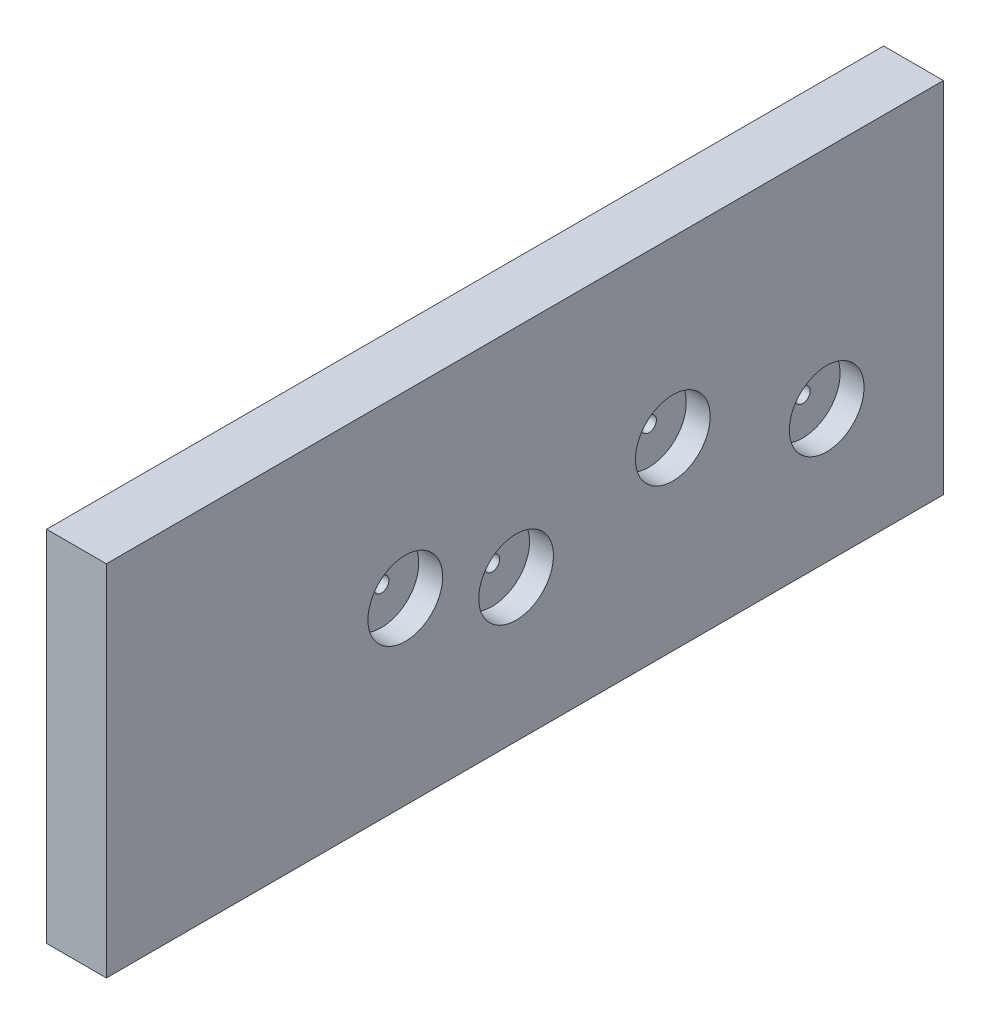
ISO-10303-21;
HEADER;
FILE_DESCRIPTION(('STEP AP214'),'2;1');
FILE_NAME('part.step','',(''),(''),'','','');
FILE_SCHEMA(('AUTOMOTIVE_DESIGN { 1 0 10303 214 1 1 1 1 }'));
ENDSEC;
DATA;
#1=APPLICATION_CONTEXT('core data for automotive mechanical design processes');
#2=APPLICATION_PROTOCOL_DEFINITION('international standard','automotive_design',2000,#1);
#3=PRODUCT_CONTEXT('',#1,'mechanical');
#4=PRODUCT('Part','Part','',(#3));
#5=PRODUCT_RELATED_PRODUCT_CATEGORY('part','',(#4));
#6=PRODUCT_DEFINITION_FORMATION('','',#4);
#7=PRODUCT_DEFINITION_CONTEXT('part definition',#1,'design');
#8=PRODUCT_DEFINITION('design','',#6,#7);
#9=PRODUCT_DEFINITION_SHAPE('','',#8);
#10=(LENGTH_UNIT() NAMED_UNIT(*) SI_UNIT(.MILLI.,.METRE.));
#11=(NAMED_UNIT(*) PLANE_ANGLE_UNIT() SI_UNIT($,.RADIAN.));
#12=(NAMED_UNIT(*) SI_UNIT($,.STERADIAN.) SOLID_ANGLE_UNIT());
#13=UNCERTAINTY_MEASURE_WITH_UNIT(LENGTH_MEASURE(1.E-05),#10,'distance_accuracy_value','');
#14=(GEOMETRIC_REPRESENTATION_CONTEXT(3) GLOBAL_UNCERTAINTY_ASSIGNED_CONTEXT((#13)) GLOBAL_UNIT_ASSIGNED_CONTEXT((#10,
#11,#12)) REPRESENTATION_CONTEXT('',''));
#15=CARTESIAN_POINT('',(0.,0.,0.));
#16=DIRECTION('',(0.,0.,1.));
#17=DIRECTION('',(1.,0.,0.));
#18=AXIS2_PLACEMENT_3D('',#15,#16,#17);
#19=CARTESIAN_POINT('',(12.7,-38.1,0.));
#20=DIRECTION('',(0.,1.,0.));
#21=DIRECTION('',(0.,0.,1.));
#22=AXIS2_PLACEMENT_3D('',#19,#20,#21);
#23=PLANE('',#22);
#24=CARTESIAN_POINT('',(6.35000000000001,-38.1,0.));
#25=DIRECTION('',(0.,-1.,0.));
#26=DIRECTION('',(0.,0.,-1.));
#27=AXIS2_PLACEMENT_3D('',#24,#25,#26);
#28=CIRCLE('',#27,3.175);
#29=CARTESIAN_POINT('',(6.35000000000001,-38.1,-3.175));
#30=VERTEX_POINT('',#29);
#31=EDGE_CURVE('E109',#30,#30,#28,.T.);
#32=ORIENTED_EDGE('',*,*,#31,.F.);
#33=EDGE_LOOP('',(#32));
#34=FACE_BOUND('',#33,.T.);
#35=CARTESIAN_POINT('',(6.35,-38.1,57.15));
#36=DIRECTION('',(0.,-1.,0.));
#37=DIRECTION('',(0.,0.,-1.));
#38=AXIS2_PLACEMENT_3D('',#35,#36,#37);
#39=CIRCLE('',#38,3.175);
#40=CARTESIAN_POINT('',(6.35,-38.1,53.975));
#41=VERTEX_POINT('',#40);
#42=EDGE_CURVE('E108',#41,#41,#39,.T.);
#43=ORIENTED_EDGE('',*,*,#42,.F.);
#44=EDGE_LOOP('',(#43));
#45=FACE_BOUND('',#44,.T.);
#46=CARTESIAN_POINT('',(6.35000000000002,-38.1,-63.5));
#47=DIRECTION('',(0.,-1.,0.));
#48=DIRECTION('',(0.,0.,-1.));
#49=AXIS2_PLACEMENT_3D('',#46,#47,#48);
#50=CIRCLE('',#49,3.175);
#51=CARTESIAN_POINT('',(6.35000000000002,-38.1,-66.675));
#52=VERTEX_POINT('',#51);
#53=EDGE_CURVE('E119',#52,#52,#50,.T.);
#54=ORIENTED_EDGE('',*,*,#53,.F.);
#55=EDGE_LOOP('',(#54));
#56=FACE_BOUND('',#55,.T.);
#57=DIRECTION('',(0.,0.,-1.));
#58=VECTOR('',#57,1.);
#59=CARTESIAN_POINT('',(0.,-38.1,0.));
#60=LINE('',#59,#58);
#61=CARTESIAN_POINT('',(0.,-38.1,101.6));
#62=VERTEX_POINT('',#61);
#63=CARTESIAN_POINT('',(0.,-38.1,-76.2));
#64=VERTEX_POINT('',#63);
#65=EDGE_CURVE('E159',#62,#64,#60,.T.);
#66=ORIENTED_EDGE('',*,*,#65,.T.);
#67=DIRECTION('',(-1.,0.,0.));
#68=VECTOR('',#67,1.);
#69=CARTESIAN_POINT('',(12.7,-38.1,-76.2));
#70=LINE('',#69,#68);
#71=CARTESIAN_POINT('',(12.7,-38.1,-76.2));
#72=VERTEX_POINT('',#71);
#73=EDGE_CURVE('E11',#72,#64,#70,.T.);
#74=ORIENTED_EDGE('',*,*,#73,.F.);
#75=DIRECTION('',(0.,0.,-1.));
#76=VECTOR('',#75,1.);
#77=CARTESIAN_POINT('',(12.7,-38.1,0.));
#78=LINE('',#77,#76);
#79=CARTESIAN_POINT('',(12.7,-38.1,101.6));
#80=VERTEX_POINT('',#79);
#81=EDGE_CURVE('E150',#80,#72,#78,.T.);
#82=ORIENTED_EDGE('',*,*,#81,.F.);
#83=DIRECTION('',(-1.,0.,0.));
#84=VECTOR('',#83,1.);
#85=CARTESIAN_POINT('',(12.7,-38.1,101.6));
#86=LINE('',#85,#84);
#87=EDGE_CURVE('E158',#80,#62,#86,.T.);
#88=ORIENTED_EDGE('',*,*,#87,.T.);
#89=EDGE_LOOP('',(#66,#74,#82,#88));
#90=FACE_BOUND('',#89,.T.);
#91=ADVANCED_FACE('F43',(#34,#45,#56,#90),#23,.F.);
#92=CARTESIAN_POINT('',(12.7,0.,-76.2));
#93=DIRECTION('',(0.,0.,1.));
#94=DIRECTION('',(1.,0.,0.));
#95=AXIS2_PLACEMENT_3D('',#92,#93,#94);
#96=PLANE('',#95);
#97=DIRECTION('',(0.,1.,0.));
#98=VECTOR('',#97,1.);
#99=CARTESIAN_POINT('',(0.,0.,-76.2));
#100=LINE('',#99,#98);
#101=CARTESIAN_POINT('',(0.,38.1,-76.2));
#102=VERTEX_POINT('',#101);
#103=EDGE_CURVE('E162',#64,#102,#100,.T.);
#104=ORIENTED_EDGE('',*,*,#103,.T.);
#105=DIRECTION('',(-1.,0.,0.));
#106=VECTOR('',#105,1.);
#107=CARTESIAN_POINT('',(12.7,38.1,-76.2));
#108=LINE('',#107,#106);
#109=CARTESIAN_POINT('',(12.7,38.1,-76.2));
#110=VERTEX_POINT('',#109);
#111=EDGE_CURVE('E52',#110,#102,#108,.T.);
#112=ORIENTED_EDGE('',*,*,#111,.F.);
#113=DIRECTION('',(0.,1.,0.));
#114=VECTOR('',#113,1.);
#115=CARTESIAN_POINT('',(12.7,0.,-76.2));
#116=LINE('',#115,#114);
#117=EDGE_CURVE('E88',#72,#110,#116,.T.);
#118=ORIENTED_EDGE('',*,*,#117,.F.);
#119=ORIENTED_EDGE('',*,*,#73,.T.);
#120=EDGE_LOOP('',(#104,#112,#118,#119));
#121=FACE_BOUND('',#120,.T.);
#122=ADVANCED_FACE('F230',(#121),#96,.F.);
#123=CARTESIAN_POINT('',(12.7,38.1,0.));
#124=DIRECTION('',(0.,1.,0.));
#125=DIRECTION('',(0.,0.,1.));
#126=AXIS2_PLACEMENT_3D('',#123,#124,#125);
#127=PLANE('',#126);
#128=DIRECTION('',(0.,0.,-1.));
#129=VECTOR('',#128,1.);
#130=CARTESIAN_POINT('',(0.,38.1,0.));
#131=LINE('',#130,#129);
#132=CARTESIAN_POINT('',(0.,38.1,101.6));
#133=VERTEX_POINT('',#132);
#134=EDGE_CURVE('E165',#133,#102,#131,.T.);
#135=ORIENTED_EDGE('',*,*,#134,.F.);
#136=DIRECTION('',(-1.,0.,0.));
#137=VECTOR('',#136,1.);
#138=CARTESIAN_POINT('',(12.7,38.1,101.6));
#139=LINE('',#138,#137);
#140=CARTESIAN_POINT('',(12.7,38.1,101.6));
#141=VERTEX_POINT('',#140);
#142=EDGE_CURVE('E78',#141,#133,#139,.T.);
#143=ORIENTED_EDGE('',*,*,#142,.F.);
#144=DIRECTION('',(0.,0.,-1.));
#145=VECTOR('',#144,1.);
#146=CARTESIAN_POINT('',(12.7,38.1,0.));
#147=LINE('',#146,#145);
#148=EDGE_CURVE('E154',#141,#110,#147,.T.);
#149=ORIENTED_EDGE('',*,*,#148,.T.);
#150=ORIENTED_EDGE('',*,*,#111,.T.);
#151=EDGE_LOOP('',(#135,#143,#149,#150));
#152=FACE_BOUND('',#151,.T.);
#153=ADVANCED_FACE('F201',(#152),#127,.T.);
#154=CARTESIAN_POINT('',(12.7,-9.873506971,-51.4082559918149));
#155=DIRECTION('',(-1.,0.,0.));
#156=DIRECTION('',(0.,0.,1.));
#157=AXIS2_PLACEMENT_3D('',#154,#155,#156);
#158=CYLINDRICAL_SURFACE('',#157,1.5875);
#159=CARTESIAN_POINT('',(7.62,-9.873506971,-51.4082559918149));
#160=DIRECTION('',(-1.,0.,0.));
#161=DIRECTION('',(0.,0.,1.));
#162=AXIS2_PLACEMENT_3D('',#159,#160,#161);
#163=CIRCLE('',#162,1.5875);
#164=CARTESIAN_POINT('',(7.62,-9.873506971,-49.8207559918149));
#165=VERTEX_POINT('',#164);
#166=EDGE_CURVE('E46',#165,#165,#163,.T.);
#167=ORIENTED_EDGE('',*,*,#166,.F.);
#168=EDGE_LOOP('',(#167));
#169=FACE_BOUND('',#168,.T.);
#170=CARTESIAN_POINT('',(0.,-9.873506971,-51.4082559918149));
#171=DIRECTION('',(1.,0.,0.));
#172=DIRECTION('',(0.,0.,-1.));
#173=AXIS2_PLACEMENT_3D('',#170,#171,#172);
#174=CIRCLE('',#173,1.5875);
#175=CARTESIAN_POINT('',(0.,-9.873506971,-52.9957559918149));
#176=VERTEX_POINT('',#175);
#177=EDGE_CURVE('E175',#176,#176,#174,.T.);
#178=ORIENTED_EDGE('',*,*,#177,.F.);
#179=EDGE_LOOP('',(#178));
#180=FACE_BOUND('',#179,.T.);
#181=ADVANCED_FACE('F197',(#169,#180),#158,.F.);
#182=CARTESIAN_POINT('',(12.7,1.096077429,-18.7225315801618));
#183=DIRECTION('',(-1.,0.,0.));
#184=DIRECTION('',(0.,0.,1.));
#185=AXIS2_PLACEMENT_3D('',#182,#183,#184);
#186=CYLINDRICAL_SURFACE('',#185,1.5875);
#187=CARTESIAN_POINT('',(7.62,1.096077429,-18.7225315801618));
#188=DIRECTION('',(-1.,0.,0.));
#189=DIRECTION('',(0.,0.,1.));
#190=AXIS2_PLACEMENT_3D('',#187,#188,#189);
#191=CIRCLE('',#190,1.5875);
#192=CARTESIAN_POINT('',(7.62,1.096077429,-17.1350315801618));
#193=VERTEX_POINT('',#192);
#194=EDGE_CURVE('E187',#193,#193,#191,.T.);
#195=ORIENTED_EDGE('',*,*,#194,.F.);
#196=EDGE_LOOP('',(#195));
#197=FACE_BOUND('',#196,.T.);
#198=CARTESIAN_POINT('',(0.,1.096077429,-18.7225315801618));
#199=DIRECTION('',(1.,0.,0.));
#200=DIRECTION('',(0.,0.,-1.));
#201=AXIS2_PLACEMENT_3D('',#198,#199,#200);
#202=CIRCLE('',#201,1.5875);
#203=CARTESIAN_POINT('',(0.,1.096077429,-20.3100315801618));
#204=VERTEX_POINT('',#203);
#205=EDGE_CURVE('E172',#204,#204,#202,.T.);
#206=ORIENTED_EDGE('',*,*,#205,.F.);
#207=EDGE_LOOP('',(#206));
#208=FACE_BOUND('',#207,.T.);
#209=ADVANCED_FACE('F200',(#197,#208),#186,.F.);
#210=CARTESIAN_POINT('',(12.7,0.,38.1));
#211=DIRECTION('',(-1.,0.,0.));
#212=DIRECTION('',(0.,0.,1.));
#213=AXIS2_PLACEMENT_3D('',#210,#211,#212);
#214=CYLINDRICAL_SURFACE('',#213,1.5875);
#215=CARTESIAN_POINT('',(7.62,0.,38.1));
#216=DIRECTION('',(-1.,0.,0.));
#217=DIRECTION('',(0.,0.,1.));
#218=AXIS2_PLACEMENT_3D('',#215,#216,#217);
#219=CIRCLE('',#218,1.5875);
#220=CARTESIAN_POINT('',(7.62,0.,39.6875));
#221=VERTEX_POINT('',#220);
#222=EDGE_CURVE('E185',#221,#221,#219,.T.);
#223=ORIENTED_EDGE('',*,*,#222,.F.);
#224=EDGE_LOOP('',(#223));
#225=FACE_BOUND('',#224,.T.);
#226=CARTESIAN_POINT('',(0.,0.,38.1));
#227=DIRECTION('',(1.,0.,0.));
#228=DIRECTION('',(0.,0.,-1.));
#229=AXIS2_PLACEMENT_3D('',#226,#227,#228);
#230=CIRCLE('',#229,1.5875);
#231=CARTESIAN_POINT('',(0.,0.,36.5125));
#232=VERTEX_POINT('',#231);
#233=EDGE_CURVE('E169',#232,#232,#230,.T.);
#234=ORIENTED_EDGE('',*,*,#233,.F.);
#235=EDGE_LOOP('',(#234));
#236=FACE_BOUND('',#235,.T.);
#237=ADVANCED_FACE('F226',(#225,#236),#214,.F.);
#238=CARTESIAN_POINT('',(12.7,0.,101.6));
#239=DIRECTION('',(0.,0.,-1.));
#240=DIRECTION('',(-1.,0.,0.));
#241=AXIS2_PLACEMENT_3D('',#238,#239,#240);
#242=PLANE('',#241);
#243=DIRECTION('',(0.,-1.,0.));
#244=VECTOR('',#243,1.);
#245=CARTESIAN_POINT('',(0.,0.,101.6));
#246=LINE('',#245,#244);
#247=EDGE_CURVE('E81',#133,#62,#246,.T.);
#248=ORIENTED_EDGE('',*,*,#247,.T.);
#249=ORIENTED_EDGE('',*,*,#87,.F.);
#250=DIRECTION('',(0.,-1.,0.));
#251=VECTOR('',#250,1.);
#252=CARTESIAN_POINT('',(12.7,0.,101.6));
#253=LINE('',#252,#251);
#254=EDGE_CURVE('E61',#141,#80,#253,.T.);
#255=ORIENTED_EDGE('',*,*,#254,.F.);
#256=ORIENTED_EDGE('',*,*,#142,.T.);
#257=EDGE_LOOP('',(#248,#249,#255,#256));
#258=FACE_BOUND('',#257,.T.);
#259=ADVANCED_FACE('F216',(#258),#242,.F.);
#260=CARTESIAN_POINT('',(12.7,-7.860160654,14.5712240149026));
#261=DIRECTION('',(-1.,0.,0.));
#262=DIRECTION('',(0.,0.,1.));
#263=AXIS2_PLACEMENT_3D('',#260,#261,#262);
#264=CYLINDRICAL_SURFACE('',#263,1.5875);
#265=CARTESIAN_POINT('',(7.62,-7.860160654,14.5712240149026));
#266=DIRECTION('',(-1.,0.,0.));
#267=DIRECTION('',(0.,0.,1.));
#268=AXIS2_PLACEMENT_3D('',#265,#266,#267);
#269=CIRCLE('',#268,1.5875);
#270=CARTESIAN_POINT('',(7.62,-7.860160654,16.1587240149026));
#271=VERTEX_POINT('',#270);
#272=EDGE_CURVE('E129',#271,#271,#269,.T.);
#273=ORIENTED_EDGE('',*,*,#272,.F.);
#274=EDGE_LOOP('',(#273));
#275=FACE_BOUND('',#274,.T.);
#276=CARTESIAN_POINT('',(0.,-7.860160654,14.5712240149026));
#277=DIRECTION('',(1.,0.,0.));
#278=DIRECTION('',(0.,0.,-1.));
#279=AXIS2_PLACEMENT_3D('',#276,#277,#278);
#280=CIRCLE('',#279,1.5875);
#281=CARTESIAN_POINT('',(0.,-7.860160654,12.9837240149026));
#282=VERTEX_POINT('',#281);
#283=EDGE_CURVE('E152',#282,#282,#280,.T.);
#284=ORIENTED_EDGE('',*,*,#283,.F.);
#285=EDGE_LOOP('',(#284));
#286=FACE_BOUND('',#285,.T.);
#287=ADVANCED_FACE('F214',(#275,#286),#264,.F.);
#288=CARTESIAN_POINT('',(12.7,0.,0.));
#289=DIRECTION('',(1.,0.,0.));
#290=DIRECTION('',(0.,0.,-1.));
#291=AXIS2_PLACEMENT_3D('',#288,#289,#290);
#292=PLANE('',#291);
#293=CARTESIAN_POINT('',(12.7,0.,38.1));
#294=DIRECTION('',(-1.,0.,0.));
#295=DIRECTION('',(0.,0.,1.));
#296=AXIS2_PLACEMENT_3D('',#293,#294,#295);
#297=CIRCLE('',#296,7.9375);
#298=CARTESIAN_POINT('',(12.7,0.,46.0375));
#299=VERTEX_POINT('',#298);
#300=EDGE_CURVE('E130',#299,#299,#297,.T.);
#301=ORIENTED_EDGE('',*,*,#300,.T.);
#302=EDGE_LOOP('',(#301));
#303=FACE_BOUND('',#302,.T.);
#304=CARTESIAN_POINT('',(12.7,-7.860160654,14.5712240149026));
#305=DIRECTION('',(-1.,0.,0.));
#306=DIRECTION('',(0.,0.,1.));
#307=AXIS2_PLACEMENT_3D('',#304,#305,#306);
#308=CIRCLE('',#307,7.9375);
#309=CARTESIAN_POINT('',(12.7,-7.860160654,22.5087240149026));
#310=VERTEX_POINT('',#309);
#311=EDGE_CURVE('E133',#310,#310,#308,.T.);
#312=ORIENTED_EDGE('',*,*,#311,.T.);
#313=EDGE_LOOP('',(#312));
#314=FACE_BOUND('',#313,.T.);
#315=CARTESIAN_POINT('',(12.7,1.096077429,-18.7225315801618));
#316=DIRECTION('',(-1.,0.,0.));
#317=DIRECTION('',(0.,0.,1.));
#318=AXIS2_PLACEMENT_3D('',#315,#316,#317);
#319=CIRCLE('',#318,7.9375);
#320=CARTESIAN_POINT('',(12.7,1.096077429,-10.7850315801618));
#321=VERTEX_POINT('',#320);
#322=EDGE_CURVE('E139',#321,#321,#319,.T.);
#323=ORIENTED_EDGE('',*,*,#322,.T.);
#324=EDGE_LOOP('',(#323));
#325=FACE_BOUND('',#324,.T.);
#326=CARTESIAN_POINT('',(12.7,-9.873506971,-51.4082559918149));
#327=DIRECTION('',(-1.,0.,0.));
#328=DIRECTION('',(0.,0.,1.));
#329=AXIS2_PLACEMENT_3D('',#326,#327,#328);
#330=CIRCLE('',#329,7.9375);
#331=CARTESIAN_POINT('',(12.7,-9.873506971,-43.4707559918149));
#332=VERTEX_POINT('',#331);
#333=EDGE_CURVE('E145',#332,#332,#330,.T.);
#334=ORIENTED_EDGE('',*,*,#333,.T.);
#335=EDGE_LOOP('',(#334));
#336=FACE_BOUND('',#335,.T.);
#337=ORIENTED_EDGE('',*,*,#81,.T.);
#338=ORIENTED_EDGE('',*,*,#117,.T.);
#339=ORIENTED_EDGE('',*,*,#148,.F.);
#340=ORIENTED_EDGE('',*,*,#254,.T.);
#341=EDGE_LOOP('',(#337,#338,#339,#340));
#342=FACE_BOUND('',#341,.T.);
#343=ADVANCED_FACE('F209',(#303,#314,#325,#336,#342),#292,.T.);
#344=CARTESIAN_POINT('',(0.,0.,0.));
#345=DIRECTION('',(1.,0.,0.));
#346=DIRECTION('',(0.,0.,-1.));
#347=AXIS2_PLACEMENT_3D('',#344,#345,#346);
#348=PLANE('',#347);
#349=ORIENTED_EDGE('',*,*,#65,.F.);
#350=ORIENTED_EDGE('',*,*,#247,.F.);
#351=ORIENTED_EDGE('',*,*,#134,.T.);
#352=ORIENTED_EDGE('',*,*,#103,.F.);
#353=EDGE_LOOP('',(#349,#350,#351,#352));
#354=FACE_BOUND('',#353,.T.);
#355=ORIENTED_EDGE('',*,*,#233,.T.);
#356=EDGE_LOOP('',(#355));
#357=FACE_BOUND('',#356,.T.);
#358=ORIENTED_EDGE('',*,*,#205,.T.);
#359=EDGE_LOOP('',(#358));
#360=FACE_BOUND('',#359,.T.);
#361=ORIENTED_EDGE('',*,*,#177,.T.);
#362=EDGE_LOOP('',(#361));
#363=FACE_BOUND('',#362,.T.);
#364=ORIENTED_EDGE('',*,*,#283,.T.);
#365=EDGE_LOOP('',(#364));
#366=FACE_BOUND('',#365,.T.);
#367=ADVANCED_FACE('F205',(#354,#357,#360,#363,#366),#348,.F.);
#368=CARTESIAN_POINT('',(7.62,-9.873506971,-51.4082559918149));
#369=DIRECTION('',(1.,0.,0.));
#370=DIRECTION('',(0.,0.,-1.));
#371=AXIS2_PLACEMENT_3D('',#368,#369,#370);
#372=CYLINDRICAL_SURFACE('',#371,7.9375);
#373=CARTESIAN_POINT('',(7.62,-9.873506971,-51.4082559918149));
#374=DIRECTION('',(-1.,0.,0.));
#375=DIRECTION('',(0.,0.,1.));
#376=AXIS2_PLACEMENT_3D('',#373,#374,#375);
#377=CIRCLE('',#376,7.9375);
#378=CARTESIAN_POINT('',(7.62,-9.873506971,-43.4707559918149));
#379=VERTEX_POINT('',#378);
#380=EDGE_CURVE('E125',#379,#379,#377,.T.);
#381=ORIENTED_EDGE('',*,*,#380,.T.);
#382=EDGE_LOOP('',(#381));
#383=FACE_BOUND('',#382,.T.);
#384=ORIENTED_EDGE('',*,*,#333,.F.);
#385=EDGE_LOOP('',(#384));
#386=FACE_BOUND('',#385,.T.);
#387=ADVANCED_FACE('F208',(#383,#386),#372,.F.);
#388=CARTESIAN_POINT('',(7.62,-9.873506971,-51.4082559918149));
#389=DIRECTION('',(-1.,0.,0.));
#390=DIRECTION('',(0.,0.,1.));
#391=AXIS2_PLACEMENT_3D('',#388,#389,#390);
#392=PLANE('',#391);
#393=ORIENTED_EDGE('',*,*,#166,.T.);
#394=EDGE_LOOP('',(#393));
#395=FACE_BOUND('',#394,.T.);
#396=ORIENTED_EDGE('',*,*,#380,.F.);
#397=EDGE_LOOP('',(#396));
#398=FACE_BOUND('',#397,.T.);
#399=ADVANCED_FACE('F194',(#395,#398),#392,.F.);
#400=CARTESIAN_POINT('',(7.62,1.096077429,-18.7225315801618));
#401=DIRECTION('',(1.,0.,0.));
#402=DIRECTION('',(0.,0.,-1.));
#403=AXIS2_PLACEMENT_3D('',#400,#401,#402);
#404=CYLINDRICAL_SURFACE('',#403,7.9375);
#405=CARTESIAN_POINT('',(7.62,1.096077429,-18.7225315801618));
#406=DIRECTION('',(-1.,0.,0.));
#407=DIRECTION('',(0.,0.,1.));
#408=AXIS2_PLACEMENT_3D('',#405,#406,#407);
#409=CIRCLE('',#408,7.9375);
#410=CARTESIAN_POINT('',(7.62,1.096077429,-10.7850315801618));
#411=VERTEX_POINT('',#410);
#412=EDGE_CURVE('E142',#411,#411,#409,.T.);
#413=ORIENTED_EDGE('',*,*,#412,.T.);
#414=EDGE_LOOP('',(#413));
#415=FACE_BOUND('',#414,.T.);
#416=ORIENTED_EDGE('',*,*,#322,.F.);
#417=EDGE_LOOP('',(#416));
#418=FACE_BOUND('',#417,.T.);
#419=ADVANCED_FACE('F371',(#415,#418),#404,.F.);
#420=CARTESIAN_POINT('',(7.62,1.096077429,-18.7225315801618));
#421=DIRECTION('',(-1.,0.,0.));
#422=DIRECTION('',(0.,0.,1.));
#423=AXIS2_PLACEMENT_3D('',#420,#421,#422);
#424=PLANE('',#423);
#425=ORIENTED_EDGE('',*,*,#194,.T.);
#426=EDGE_LOOP('',(#425));
#427=FACE_BOUND('',#426,.T.);
#428=ORIENTED_EDGE('',*,*,#412,.F.);
#429=EDGE_LOOP('',(#428));
#430=FACE_BOUND('',#429,.T.);
#431=ADVANCED_FACE('F380',(#427,#430),#424,.F.);
#432=CARTESIAN_POINT('',(7.62,-7.860160654,14.5712240149026));
#433=DIRECTION('',(1.,0.,0.));
#434=DIRECTION('',(0.,0.,-1.));
#435=AXIS2_PLACEMENT_3D('',#432,#433,#434);
#436=CYLINDRICAL_SURFACE('',#435,7.9375);
#437=CARTESIAN_POINT('',(7.62,-7.860160654,14.5712240149026));
#438=DIRECTION('',(-1.,0.,0.));
#439=DIRECTION('',(0.,0.,1.));
#440=AXIS2_PLACEMENT_3D('',#437,#438,#439);
#441=CIRCLE('',#440,7.9375);
#442=CARTESIAN_POINT('',(7.62,-7.860160654,22.5087240149026));
#443=VERTEX_POINT('',#442);
#444=EDGE_CURVE('E136',#443,#443,#441,.T.);
#445=ORIENTED_EDGE('',*,*,#444,.T.);
#446=EDGE_LOOP('',(#445));
#447=FACE_BOUND('',#446,.T.);
#448=ORIENTED_EDGE('',*,*,#311,.F.);
#449=EDGE_LOOP('',(#448));
#450=FACE_BOUND('',#449,.T.);
#451=ADVANCED_FACE('F390',(#447,#450),#436,.F.);
#452=CARTESIAN_POINT('',(7.62,-7.860160654,14.5712240149026));
#453=DIRECTION('',(-1.,0.,0.));
#454=DIRECTION('',(0.,0.,1.));
#455=AXIS2_PLACEMENT_3D('',#452,#453,#454);
#456=PLANE('',#455);
#457=ORIENTED_EDGE('',*,*,#272,.T.);
#458=EDGE_LOOP('',(#457));
#459=FACE_BOUND('',#458,.T.);
#460=ORIENTED_EDGE('',*,*,#444,.F.);
#461=EDGE_LOOP('',(#460));
#462=FACE_BOUND('',#461,.T.);
#463=ADVANCED_FACE('F399',(#459,#462),#456,.F.);
#464=CARTESIAN_POINT('',(7.62,0.,38.1));
#465=DIRECTION('',(1.,0.,0.));
#466=DIRECTION('',(0.,0.,-1.));
#467=AXIS2_PLACEMENT_3D('',#464,#465,#466);
#468=CYLINDRICAL_SURFACE('',#467,7.9375);
#469=CARTESIAN_POINT('',(7.62,0.,38.1));
#470=DIRECTION('',(-1.,0.,0.));
#471=DIRECTION('',(0.,0.,1.));
#472=AXIS2_PLACEMENT_3D('',#469,#470,#471);
#473=CIRCLE('',#472,7.9375);
#474=CARTESIAN_POINT('',(7.62,0.,46.0375));
#475=VERTEX_POINT('',#474);
#476=EDGE_CURVE('E126',#475,#475,#473,.T.);
#477=ORIENTED_EDGE('',*,*,#476,.T.);
#478=EDGE_LOOP('',(#477));
#479=FACE_BOUND('',#478,.T.);
#480=ORIENTED_EDGE('',*,*,#300,.F.);
#481=EDGE_LOOP('',(#480));
#482=FACE_BOUND('',#481,.T.);
#483=ADVANCED_FACE('F409',(#479,#482),#468,.F.);
#484=CARTESIAN_POINT('',(7.62,0.,38.1));
#485=DIRECTION('',(-1.,0.,0.));
#486=DIRECTION('',(0.,0.,1.));
#487=AXIS2_PLACEMENT_3D('',#484,#485,#486);
#488=PLANE('',#487);
#489=ORIENTED_EDGE('',*,*,#222,.T.);
#490=EDGE_LOOP('',(#489));
#491=FACE_BOUND('',#490,.T.);
#492=ORIENTED_EDGE('',*,*,#476,.F.);
#493=EDGE_LOOP('',(#492));
#494=FACE_BOUND('',#493,.T.);
#495=ADVANCED_FACE('F419',(#491,#494),#488,.F.);
#496=CARTESIAN_POINT('',(6.35000000000002,0.,-63.5));
#497=DIRECTION('',(0.,-1.,0.));
#498=DIRECTION('',(0.,0.,-1.));
#499=AXIS2_PLACEMENT_3D('',#496,#497,#498);
#500=CONICAL_SURFACE('',#499,3.17499999999999,1.02974425867665);
#501=CARTESIAN_POINT('',(6.35000000000001,1.9077324654125,-63.5));
#502=VERTEX_POINT('',#501);
#503=VERTEX_LOOP('',#502);
#504=FACE_BOUND('',#503,.T.);
#505=CARTESIAN_POINT('',(6.35000000000002,0.,-63.5));
#506=DIRECTION('',(0.,-1.,0.));
#507=DIRECTION('',(0.,0.,-1.));
#508=AXIS2_PLACEMENT_3D('',#505,#506,#507);
#509=CIRCLE('',#508,3.17499999999999);
#510=CARTESIAN_POINT('',(6.35000000000002,0.,-66.675));
#511=VERTEX_POINT('',#510);
#512=EDGE_CURVE('E122',#511,#511,#509,.T.);
#513=ORIENTED_EDGE('',*,*,#512,.T.);
#514=EDGE_LOOP('',(#513));
#515=FACE_BOUND('',#514,.T.);
#516=ADVANCED_FACE('F428',(#504,#515),#500,.F.);
#517=CARTESIAN_POINT('',(6.35000000000002,-38.1,-63.5));
#518=DIRECTION('',(0.,-1.,0.));
#519=DIRECTION('',(0.,0.,-1.));
#520=AXIS2_PLACEMENT_3D('',#517,#518,#519);
#521=CYLINDRICAL_SURFACE('',#520,3.17499999999999);
#522=ORIENTED_EDGE('',*,*,#512,.F.);
#523=EDGE_LOOP('',(#522));
#524=FACE_BOUND('',#523,.T.);
#525=ORIENTED_EDGE('',*,*,#53,.T.);
#526=EDGE_LOOP('',(#525));
#527=FACE_BOUND('',#526,.T.);
#528=ADVANCED_FACE('F437',(#524,#527),#521,.F.);
#529=CARTESIAN_POINT('',(6.35,0.,57.15));
#530=DIRECTION('',(0.,-1.,0.));
#531=DIRECTION('',(0.,0.,-1.));
#532=AXIS2_PLACEMENT_3D('',#529,#530,#531);
#533=CONICAL_SURFACE('',#532,3.17499999999999,1.02974425867665);
#534=CARTESIAN_POINT('',(6.34999999999999,1.9077324654125,57.15));
#535=VERTEX_POINT('',#534);
#536=VERTEX_LOOP('',#535);
#537=FACE_BOUND('',#536,.T.);
#538=CARTESIAN_POINT('',(6.35,0.,57.15));
#539=DIRECTION('',(0.,-1.,0.));
#540=DIRECTION('',(0.,0.,-1.));
#541=AXIS2_PLACEMENT_3D('',#538,#539,#540);
#542=CIRCLE('',#541,3.17499999999999);
#543=CARTESIAN_POINT('',(6.35,0.,53.975));
#544=VERTEX_POINT('',#543);
#545=EDGE_CURVE('E112',#544,#544,#542,.T.);
#546=ORIENTED_EDGE('',*,*,#545,.T.);
#547=EDGE_LOOP('',(#546));
#548=FACE_BOUND('',#547,.T.);
#549=ADVANCED_FACE('F447',(#537,#548),#533,.F.);
#550=CARTESIAN_POINT('',(6.35,-38.1,57.15));
#551=DIRECTION('',(0.,-1.,0.));
#552=DIRECTION('',(0.,0.,-1.));
#553=AXIS2_PLACEMENT_3D('',#550,#551,#552);
#554=CYLINDRICAL_SURFACE('',#553,3.175);
#555=ORIENTED_EDGE('',*,*,#545,.F.);
#556=EDGE_LOOP('',(#555));
#557=FACE_BOUND('',#556,.T.);
#558=ORIENTED_EDGE('',*,*,#42,.T.);
#559=EDGE_LOOP('',(#558));
#560=FACE_BOUND('',#559,.T.);
#561=ADVANCED_FACE('F102',(#557,#560),#554,.F.);
#562=CARTESIAN_POINT('',(6.35000000000001,0.,0.));
#563=DIRECTION('',(0.,-1.,0.));
#564=DIRECTION('',(0.,0.,-1.));
#565=AXIS2_PLACEMENT_3D('',#562,#563,#564);
#566=CONICAL_SURFACE('',#565,3.17499999999999,1.02974425867665);
#567=CARTESIAN_POINT('',(6.35,1.9077324654125,0.));
#568=VERTEX_POINT('',#567);
#569=VERTEX_LOOP('',#568);
#570=FACE_BOUND('',#569,.T.);
#571=CARTESIAN_POINT('',(6.35000000000001,0.,0.));
#572=DIRECTION('',(0.,-1.,0.));
#573=DIRECTION('',(0.,0.,-1.));
#574=AXIS2_PLACEMENT_3D('',#571,#572,#573);
#575=CIRCLE('',#574,3.17499999999999);
#576=CARTESIAN_POINT('',(6.35000000000001,0.,-3.17499999999999));
#577=VERTEX_POINT('',#576);
#578=EDGE_CURVE('E106',#577,#577,#575,.T.);
#579=ORIENTED_EDGE('',*,*,#578,.T.);
#580=EDGE_LOOP('',(#579));
#581=FACE_BOUND('',#580,.T.);
#582=ADVANCED_FACE('F98',(#570,#581),#566,.F.);
#583=CARTESIAN_POINT('',(6.35000000000001,-38.1,0.));
#584=DIRECTION('',(0.,-1.,0.));
#585=DIRECTION('',(0.,0.,-1.));
#586=AXIS2_PLACEMENT_3D('',#583,#584,#585);
#587=CYLINDRICAL_SURFACE('',#586,3.175);
#588=ORIENTED_EDGE('',*,*,#578,.F.);
#589=EDGE_LOOP('',(#588));
#590=FACE_BOUND('',#589,.T.);
#591=ORIENTED_EDGE('',*,*,#31,.T.);
#592=EDGE_LOOP('',(#591));
#593=FACE_BOUND('',#592,.T.);
#594=ADVANCED_FACE('F101',(#590,#593),#587,.F.);
#595=CLOSED_SHELL('',(#91,#122,#153,#181,#209,#237,#259,#287,#343,#367,#387,#399,#419,#431,#451,
#463,#483,#495,#516,#528,#549,#561,#582,#594));
#596=MANIFOLD_SOLID_BREP('B2',#595);
#597=ADVANCED_BREP_SHAPE_REPRESENTATION('',(#18,#596),#14);
#598=SHAPE_DEFINITION_REPRESENTATION(#9,#597);
ENDSEC;
END-ISO-10303-21;
